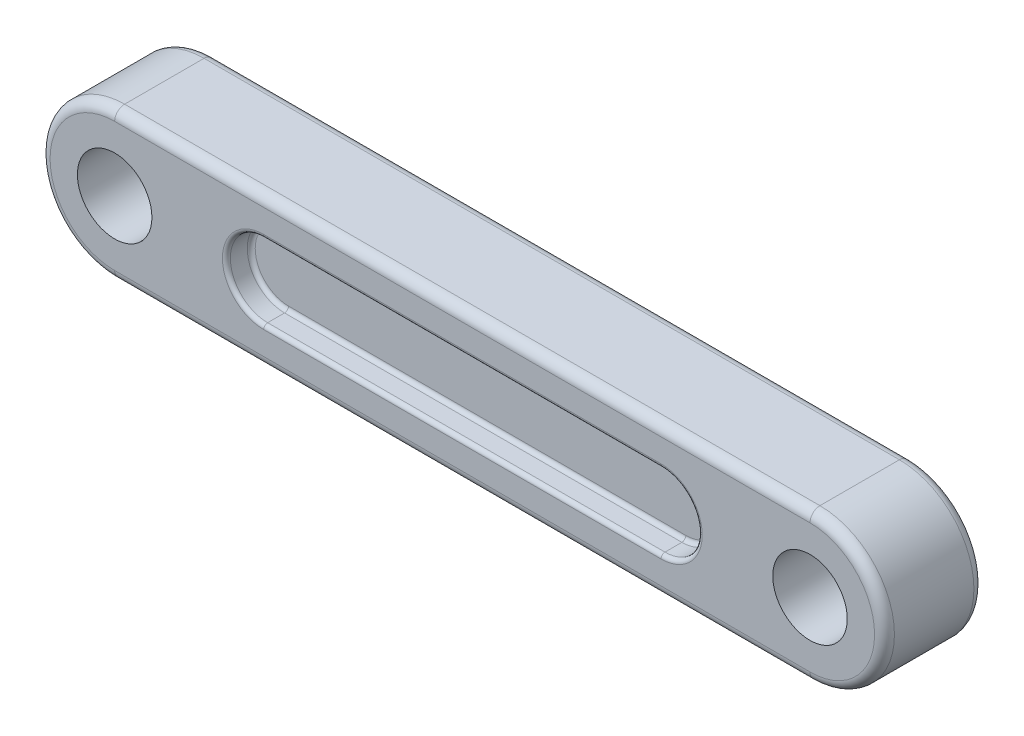
ISO-10303-21;
HEADER;
FILE_DESCRIPTION(('STEP AP214'),'2;1');
FILE_NAME('part.step','',(''),(''),'','','');
FILE_SCHEMA(('AUTOMOTIVE_DESIGN { 1 0 10303 214 1 1 1 1 }'));
ENDSEC;
DATA;
#1=APPLICATION_CONTEXT('core data for automotive mechanical design processes');
#2=APPLICATION_PROTOCOL_DEFINITION('international standard','automotive_design',2000,#1);
#3=PRODUCT_CONTEXT('',#1,'mechanical');
#4=PRODUCT('Part','Part','',(#3));
#5=PRODUCT_RELATED_PRODUCT_CATEGORY('part','',(#4));
#6=PRODUCT_DEFINITION_FORMATION('','',#4);
#7=PRODUCT_DEFINITION_CONTEXT('part definition',#1,'design');
#8=PRODUCT_DEFINITION('design','',#6,#7);
#9=PRODUCT_DEFINITION_SHAPE('','',#8);
#10=(LENGTH_UNIT() NAMED_UNIT(*) SI_UNIT(.MILLI.,.METRE.));
#11=(NAMED_UNIT(*) PLANE_ANGLE_UNIT() SI_UNIT($,.RADIAN.));
#12=(NAMED_UNIT(*) SI_UNIT($,.STERADIAN.) SOLID_ANGLE_UNIT());
#13=UNCERTAINTY_MEASURE_WITH_UNIT(LENGTH_MEASURE(1.E-05),#10,'distance_accuracy_value','');
#14=(GEOMETRIC_REPRESENTATION_CONTEXT(3) GLOBAL_UNCERTAINTY_ASSIGNED_CONTEXT((#13)) GLOBAL_UNIT_ASSIGNED_CONTEXT((#10,
#11,#12)) REPRESENTATION_CONTEXT('',''));
#15=CARTESIAN_POINT('',(0.,0.,0.));
#16=DIRECTION('',(0.,0.,1.));
#17=DIRECTION('',(1.,0.,0.));
#18=AXIS2_PLACEMENT_3D('',#15,#16,#17);
#19=CARTESIAN_POINT('',(-44.45,0.,12.7));
#20=DIRECTION('',(0.,0.,1.));
#21=DIRECTION('',(1.,0.,0.));
#22=AXIS2_PLACEMENT_3D('',#19,#20,#21);
#23=PLANE('',#22);
#24=CARTESIAN_POINT('',(25.4,0.,12.7));
#25=DIRECTION('',(0.,0.,1.));
#26=DIRECTION('',(1.,0.,0.));
#27=AXIS2_PLACEMENT_3D('',#24,#25,#26);
#28=CIRCLE('',#27,5.2705);
#29=CARTESIAN_POINT('',(25.4,5.2705,12.7));
#30=VERTEX_POINT('',#29);
#31=CARTESIAN_POINT('',(25.4,-5.2705,12.7));
#32=VERTEX_POINT('',#31);
#33=EDGE_CURVE('E297',#30,#32,#28,.F.);
#34=ORIENTED_EDGE('',*,*,#33,.T.);
#35=DIRECTION('',(1.,0.,0.));
#36=VECTOR('',#35,1.);
#37=CARTESIAN_POINT('',(-25.4,-5.2705,12.7));
#38=LINE('',#37,#36);
#39=CARTESIAN_POINT('',(-25.4,-5.2705,12.7));
#40=VERTEX_POINT('',#39);
#41=EDGE_CURVE('E299',#32,#40,#38,.F.);
#42=ORIENTED_EDGE('',*,*,#41,.T.);
#43=CARTESIAN_POINT('',(-25.4,0.,12.7));
#44=DIRECTION('',(0.,0.,1.));
#45=DIRECTION('',(1.,0.,0.));
#46=AXIS2_PLACEMENT_3D('',#43,#44,#45);
#47=CIRCLE('',#46,5.2705);
#48=CARTESIAN_POINT('',(-25.4,5.2705,12.7));
#49=VERTEX_POINT('',#48);
#50=EDGE_CURVE('E295',#40,#49,#47,.F.);
#51=ORIENTED_EDGE('',*,*,#50,.T.);
#52=DIRECTION('',(-1.,0.,0.));
#53=VECTOR('',#52,1.);
#54=CARTESIAN_POINT('',(25.4,5.2705,12.7));
#55=LINE('',#54,#53);
#56=EDGE_CURVE('E293',#49,#30,#55,.F.);
#57=ORIENTED_EDGE('',*,*,#56,.T.);
#58=EDGE_LOOP('',(#34,#42,#51,#57));
#59=FACE_BOUND('',#58,.T.);
#60=DIRECTION('',(1.,0.,0.));
#61=VECTOR('',#60,1.);
#62=CARTESIAN_POINT('',(44.45,-8.255,12.7));
#63=LINE('',#62,#61);
#64=CARTESIAN_POINT('',(-44.45,-8.25499999999998,12.7));
#65=VERTEX_POINT('',#64);
#66=CARTESIAN_POINT('',(44.45,-8.255,12.7));
#67=VERTEX_POINT('',#66);
#68=EDGE_CURVE('E232',#65,#67,#63,.T.);
#69=ORIENTED_EDGE('',*,*,#68,.T.);
#70=CARTESIAN_POINT('',(44.45,0.,12.7));
#71=DIRECTION('',(0.,0.,1.));
#72=DIRECTION('',(1.,0.,0.));
#73=AXIS2_PLACEMENT_3D('',#70,#71,#72);
#74=CIRCLE('',#73,8.255);
#75=CARTESIAN_POINT('',(44.45,8.255,12.7));
#76=VERTEX_POINT('',#75);
#77=EDGE_CURVE('E244',#67,#76,#74,.T.);
#78=ORIENTED_EDGE('',*,*,#77,.T.);
#79=DIRECTION('',(-1.,0.,0.));
#80=VECTOR('',#79,1.);
#81=CARTESIAN_POINT('',(-44.45,8.255,12.7));
#82=LINE('',#81,#80);
#83=CARTESIAN_POINT('',(-44.45,8.255,12.7));
#84=VERTEX_POINT('',#83);
#85=EDGE_CURVE('E424',#76,#84,#82,.T.);
#86=ORIENTED_EDGE('',*,*,#85,.T.);
#87=CARTESIAN_POINT('',(-44.45,0.,12.7));
#88=DIRECTION('',(0.,0.,1.));
#89=DIRECTION('',(1.,0.,0.));
#90=AXIS2_PLACEMENT_3D('',#87,#88,#89);
#91=CIRCLE('',#90,8.255);
#92=EDGE_CURVE('E426',#84,#65,#91,.T.);
#93=ORIENTED_EDGE('',*,*,#92,.T.);
#94=EDGE_LOOP('',(#69,#78,#86,#93));
#95=FACE_BOUND('',#94,.T.);
#96=CARTESIAN_POINT('',(-44.45,0.,12.7));
#97=DIRECTION('',(0.,0.,1.));
#98=DIRECTION('',(1.,0.,0.));
#99=AXIS2_PLACEMENT_3D('',#96,#97,#98);
#100=CIRCLE('',#99,4.7625);
#101=CARTESIAN_POINT('',(-39.6875,0.,12.7));
#102=VERTEX_POINT('',#101);
#103=EDGE_CURVE('E395',#102,#102,#100,.T.);
#104=ORIENTED_EDGE('',*,*,#103,.F.);
#105=EDGE_LOOP('',(#104));
#106=FACE_BOUND('',#105,.T.);
#107=CARTESIAN_POINT('',(44.45,0.,12.7));
#108=DIRECTION('',(0.,0.,1.));
#109=DIRECTION('',(1.,0.,0.));
#110=AXIS2_PLACEMENT_3D('',#107,#108,#109);
#111=CIRCLE('',#110,4.7625);
#112=CARTESIAN_POINT('',(49.2125,0.,12.7));
#113=VERTEX_POINT('',#112);
#114=EDGE_CURVE('E387',#113,#113,#111,.T.);
#115=ORIENTED_EDGE('',*,*,#114,.F.);
#116=EDGE_LOOP('',(#115));
#117=FACE_BOUND('',#116,.T.);
#118=ADVANCED_FACE('F33',(#59,#95,#106,#117),#23,.T.);
#119=CARTESIAN_POINT('',(-44.45,0.,0.));
#120=DIRECTION('',(0.,0.,1.));
#121=DIRECTION('',(1.,0.,0.));
#122=AXIS2_PLACEMENT_3D('',#119,#120,#121);
#123=PLANE('',#122);
#124=CARTESIAN_POINT('',(25.4,0.,0.));
#125=DIRECTION('',(0.,0.,1.));
#126=DIRECTION('',(1.,0.,0.));
#127=AXIS2_PLACEMENT_3D('',#124,#125,#126);
#128=CIRCLE('',#127,5.2705);
#129=CARTESIAN_POINT('',(25.4,-5.27050000000001,0.));
#130=VERTEX_POINT('',#129);
#131=CARTESIAN_POINT('',(25.4,5.27049999999999,0.));
#132=VERTEX_POINT('',#131);
#133=EDGE_CURVE('E259',#130,#132,#128,.T.);
#134=ORIENTED_EDGE('',*,*,#133,.T.);
#135=DIRECTION('',(1.,0.,0.));
#136=VECTOR('',#135,1.);
#137=CARTESIAN_POINT('',(-44.45,5.2705,0.));
#138=LINE('',#137,#136);
#139=CARTESIAN_POINT('',(-25.4,5.2705,0.));
#140=VERTEX_POINT('',#139);
#141=EDGE_CURVE('E263',#132,#140,#138,.F.);
#142=ORIENTED_EDGE('',*,*,#141,.T.);
#143=CARTESIAN_POINT('',(-25.4,0.,0.));
#144=DIRECTION('',(0.,0.,1.));
#145=DIRECTION('',(1.,0.,0.));
#146=AXIS2_PLACEMENT_3D('',#143,#144,#145);
#147=CIRCLE('',#146,5.2705);
#148=CARTESIAN_POINT('',(-25.4,-5.2705,0.));
#149=VERTEX_POINT('',#148);
#150=EDGE_CURVE('E261',#140,#149,#147,.T.);
#151=ORIENTED_EDGE('',*,*,#150,.T.);
#152=DIRECTION('',(-1.,0.,0.));
#153=VECTOR('',#152,1.);
#154=CARTESIAN_POINT('',(-44.45,-5.2705,0.));
#155=LINE('',#154,#153);
#156=EDGE_CURVE('E257',#149,#130,#155,.F.);
#157=ORIENTED_EDGE('',*,*,#156,.T.);
#158=EDGE_LOOP('',(#134,#142,#151,#157));
#159=FACE_BOUND('',#158,.T.);
#160=DIRECTION('',(1.,0.,0.));
#161=VECTOR('',#160,1.);
#162=CARTESIAN_POINT('',(-44.45,-8.255,0.));
#163=LINE('',#162,#161);
#164=CARTESIAN_POINT('',(44.45,-8.25499999999998,0.));
#165=VERTEX_POINT('',#164);
#166=CARTESIAN_POINT('',(-44.45,-8.255,0.));
#167=VERTEX_POINT('',#166);
#168=EDGE_CURVE('E411',#165,#167,#163,.F.);
#169=ORIENTED_EDGE('',*,*,#168,.T.);
#170=CARTESIAN_POINT('',(-44.45,0.,0.));
#171=DIRECTION('',(0.,0.,1.));
#172=DIRECTION('',(1.,0.,0.));
#173=AXIS2_PLACEMENT_3D('',#170,#171,#172);
#174=CIRCLE('',#173,8.255);
#175=CARTESIAN_POINT('',(-44.45,8.255,0.));
#176=VERTEX_POINT('',#175);
#177=EDGE_CURVE('E208',#167,#176,#174,.F.);
#178=ORIENTED_EDGE('',*,*,#177,.T.);
#179=DIRECTION('',(-1.,0.,0.));
#180=VECTOR('',#179,1.);
#181=CARTESIAN_POINT('',(-44.45,8.255,0.));
#182=LINE('',#181,#180);
#183=CARTESIAN_POINT('',(44.45,8.25500000000001,0.));
#184=VERTEX_POINT('',#183);
#185=EDGE_CURVE('E409',#176,#184,#182,.F.);
#186=ORIENTED_EDGE('',*,*,#185,.T.);
#187=CARTESIAN_POINT('',(44.45,0.,0.));
#188=DIRECTION('',(0.,0.,1.));
#189=DIRECTION('',(1.,0.,0.));
#190=AXIS2_PLACEMENT_3D('',#187,#188,#189);
#191=CIRCLE('',#190,8.255);
#192=EDGE_CURVE('E407',#184,#165,#191,.F.);
#193=ORIENTED_EDGE('',*,*,#192,.T.);
#194=EDGE_LOOP('',(#169,#178,#186,#193));
#195=FACE_BOUND('',#194,.T.);
#196=CARTESIAN_POINT('',(-44.45,0.,0.));
#197=DIRECTION('',(0.,0.,1.));
#198=DIRECTION('',(1.,0.,0.));
#199=AXIS2_PLACEMENT_3D('',#196,#197,#198);
#200=CIRCLE('',#199,4.7625);
#201=CARTESIAN_POINT('',(-39.6875,0.,0.));
#202=VERTEX_POINT('',#201);
#203=EDGE_CURVE('E390',#202,#202,#200,.T.);
#204=ORIENTED_EDGE('',*,*,#203,.T.);
#205=EDGE_LOOP('',(#204));
#206=FACE_BOUND('',#205,.T.);
#207=CARTESIAN_POINT('',(44.45,0.,0.));
#208=DIRECTION('',(0.,0.,1.));
#209=DIRECTION('',(1.,0.,0.));
#210=AXIS2_PLACEMENT_3D('',#207,#208,#209);
#211=CIRCLE('',#210,4.7625);
#212=CARTESIAN_POINT('',(49.2125,0.,0.));
#213=VERTEX_POINT('',#212);
#214=EDGE_CURVE('E391',#213,#213,#211,.T.);
#215=ORIENTED_EDGE('',*,*,#214,.T.);
#216=EDGE_LOOP('',(#215));
#217=FACE_BOUND('',#216,.T.);
#218=ADVANCED_FACE('F466',(#159,#195,#206,#217),#123,.F.);
#219=CARTESIAN_POINT('',(-44.45,0.,12.7));
#220=DIRECTION('',(0.,0.,-1.));
#221=DIRECTION('',(-1.,0.,0.));
#222=AXIS2_PLACEMENT_3D('',#219,#220,#221);
#223=CYLINDRICAL_SURFACE('',#222,9.525);
#224=DIRECTION('',(0.,0.,-1.));
#225=VECTOR('',#224,1.);
#226=CARTESIAN_POINT('',(-44.45,9.525,12.7));
#227=LINE('',#226,#225);
#228=CARTESIAN_POINT('',(-44.45,9.525,11.43));
#229=VERTEX_POINT('',#228);
#230=CARTESIAN_POINT('',(-44.45,9.525,1.27));
#231=VERTEX_POINT('',#230);
#232=EDGE_CURVE('E398',#229,#231,#227,.T.);
#233=ORIENTED_EDGE('',*,*,#232,.T.);
#234=CARTESIAN_POINT('',(-44.45,0.,1.27));
#235=DIRECTION('',(0.,0.,1.));
#236=DIRECTION('',(1.,0.,0.));
#237=AXIS2_PLACEMENT_3D('',#234,#235,#236);
#238=CIRCLE('',#237,9.525);
#239=CARTESIAN_POINT('',(-44.45,-9.525,1.27));
#240=VERTEX_POINT('',#239);
#241=EDGE_CURVE('E218',#231,#240,#238,.T.);
#242=ORIENTED_EDGE('',*,*,#241,.T.);
#243=DIRECTION('',(0.,0.,-1.));
#244=VECTOR('',#243,1.);
#245=CARTESIAN_POINT('',(-44.45,-9.525,12.7));
#246=LINE('',#245,#244);
#247=CARTESIAN_POINT('',(-44.45,-9.525,11.43));
#248=VERTEX_POINT('',#247);
#249=EDGE_CURVE('E200',#248,#240,#246,.T.);
#250=ORIENTED_EDGE('',*,*,#249,.F.);
#251=CARTESIAN_POINT('',(-44.45,0.,11.43));
#252=DIRECTION('',(0.,0.,1.));
#253=DIRECTION('',(1.,0.,0.));
#254=AXIS2_PLACEMENT_3D('',#251,#252,#253);
#255=CIRCLE('',#254,9.525);
#256=EDGE_CURVE('E215',#248,#229,#255,.F.);
#257=ORIENTED_EDGE('',*,*,#256,.T.);
#258=EDGE_LOOP('',(#233,#242,#250,#257));
#259=FACE_BOUND('',#258,.T.);
#260=ADVANCED_FACE('F214',(#259),#223,.T.);
#261=CARTESIAN_POINT('',(-44.45,-9.525,12.7));
#262=DIRECTION('',(0.,1.,0.));
#263=DIRECTION('',(0.,0.,1.));
#264=AXIS2_PLACEMENT_3D('',#261,#262,#263);
#265=PLANE('',#264);
#266=ORIENTED_EDGE('',*,*,#249,.T.);
#267=DIRECTION('',(1.,0.,0.));
#268=VECTOR('',#267,1.);
#269=CARTESIAN_POINT('',(-44.45,-9.525,1.27));
#270=LINE('',#269,#268);
#271=CARTESIAN_POINT('',(44.45,-9.52499999999998,1.27));
#272=VERTEX_POINT('',#271);
#273=EDGE_CURVE('E207',#240,#272,#270,.T.);
#274=ORIENTED_EDGE('',*,*,#273,.T.);
#275=DIRECTION('',(0.,0.,-1.));
#276=VECTOR('',#275,1.);
#277=CARTESIAN_POINT('',(44.45,-9.52499999999998,12.7));
#278=LINE('',#277,#276);
#279=CARTESIAN_POINT('',(44.45,-9.52499999999998,11.43));
#280=VERTEX_POINT('',#279);
#281=EDGE_CURVE('E202',#280,#272,#278,.T.);
#282=ORIENTED_EDGE('',*,*,#281,.F.);
#283=DIRECTION('',(1.,0.,0.));
#284=VECTOR('',#283,1.);
#285=CARTESIAN_POINT('',(-44.45,-9.525,11.43));
#286=LINE('',#285,#284);
#287=EDGE_CURVE('E197',#280,#248,#286,.F.);
#288=ORIENTED_EDGE('',*,*,#287,.T.);
#289=EDGE_LOOP('',(#266,#274,#282,#288));
#290=FACE_BOUND('',#289,.T.);
#291=ADVANCED_FACE('F199',(#290),#265,.F.);
#292=CARTESIAN_POINT('',(44.45,0.,12.7));
#293=DIRECTION('',(0.,0.,-1.));
#294=DIRECTION('',(-1.,0.,0.));
#295=AXIS2_PLACEMENT_3D('',#292,#293,#294);
#296=CYLINDRICAL_SURFACE('',#295,9.525);
#297=ORIENTED_EDGE('',*,*,#281,.T.);
#298=CARTESIAN_POINT('',(44.45,0.,1.27));
#299=DIRECTION('',(0.,0.,1.));
#300=DIRECTION('',(1.,0.,0.));
#301=AXIS2_PLACEMENT_3D('',#298,#299,#300);
#302=CIRCLE('',#301,9.525);
#303=CARTESIAN_POINT('',(44.45,9.525,1.27));
#304=VERTEX_POINT('',#303);
#305=EDGE_CURVE('E422',#272,#304,#302,.T.);
#306=ORIENTED_EDGE('',*,*,#305,.T.);
#307=DIRECTION('',(0.,0.,-1.));
#308=VECTOR('',#307,1.);
#309=CARTESIAN_POINT('',(44.45,9.525,12.7));
#310=LINE('',#309,#308);
#311=CARTESIAN_POINT('',(44.45,9.525,11.43));
#312=VERTEX_POINT('',#311);
#313=EDGE_CURVE('E402',#312,#304,#310,.T.);
#314=ORIENTED_EDGE('',*,*,#313,.F.);
#315=CARTESIAN_POINT('',(44.45,0.,11.43));
#316=DIRECTION('',(0.,0.,1.));
#317=DIRECTION('',(1.,0.,0.));
#318=AXIS2_PLACEMENT_3D('',#315,#316,#317);
#319=CIRCLE('',#318,9.525);
#320=EDGE_CURVE('E420',#312,#280,#319,.F.);
#321=ORIENTED_EDGE('',*,*,#320,.T.);
#322=EDGE_LOOP('',(#297,#306,#314,#321));
#323=FACE_BOUND('',#322,.T.);
#324=ADVANCED_FACE('F452',(#323),#296,.T.);
#325=CARTESIAN_POINT('',(-44.45,9.525,12.7));
#326=DIRECTION('',(0.,-1.,0.));
#327=DIRECTION('',(0.,0.,-1.));
#328=AXIS2_PLACEMENT_3D('',#325,#326,#327);
#329=PLANE('',#328);
#330=ORIENTED_EDGE('',*,*,#313,.T.);
#331=DIRECTION('',(-1.,0.,0.));
#332=VECTOR('',#331,1.);
#333=CARTESIAN_POINT('',(-44.45,9.525,1.27));
#334=LINE('',#333,#332);
#335=EDGE_CURVE('E418',#304,#231,#334,.T.);
#336=ORIENTED_EDGE('',*,*,#335,.T.);
#337=ORIENTED_EDGE('',*,*,#232,.F.);
#338=DIRECTION('',(-1.,0.,0.));
#339=VECTOR('',#338,1.);
#340=CARTESIAN_POINT('',(44.45,9.525,11.43));
#341=LINE('',#340,#339);
#342=EDGE_CURVE('E416',#229,#312,#341,.F.);
#343=ORIENTED_EDGE('',*,*,#342,.T.);
#344=EDGE_LOOP('',(#330,#336,#337,#343));
#345=FACE_BOUND('',#344,.T.);
#346=ADVANCED_FACE('F449',(#345),#329,.F.);
#347=CARTESIAN_POINT('',(-44.45,0.,12.7));
#348=DIRECTION('',(0.,0.,-1.));
#349=DIRECTION('',(-1.,0.,0.));
#350=AXIS2_PLACEMENT_3D('',#347,#348,#349);
#351=CYLINDRICAL_SURFACE('',#350,4.7625);
#352=ORIENTED_EDGE('',*,*,#103,.T.);
#353=EDGE_LOOP('',(#352));
#354=FACE_BOUND('',#353,.T.);
#355=ORIENTED_EDGE('',*,*,#203,.F.);
#356=EDGE_LOOP('',(#355));
#357=FACE_BOUND('',#356,.T.);
#358=ADVANCED_FACE('F491',(#354,#357),#351,.F.);
#359=CARTESIAN_POINT('',(44.45,0.,12.7));
#360=DIRECTION('',(0.,0.,-1.));
#361=DIRECTION('',(-1.,0.,0.));
#362=AXIS2_PLACEMENT_3D('',#359,#360,#361);
#363=CYLINDRICAL_SURFACE('',#362,4.7625);
#364=ORIENTED_EDGE('',*,*,#114,.T.);
#365=EDGE_LOOP('',(#364));
#366=FACE_BOUND('',#365,.T.);
#367=ORIENTED_EDGE('',*,*,#214,.F.);
#368=EDGE_LOOP('',(#367));
#369=FACE_BOUND('',#368,.T.);
#370=ADVANCED_FACE('F481',(#366,#369),#363,.F.);
#371=CARTESIAN_POINT('',(44.45,0.,1.27));
#372=DIRECTION('',(0.,0.,1.));
#373=DIRECTION('',(1.,0.,0.));
#374=AXIS2_PLACEMENT_3D('',#371,#372,#373);
#375=TOROIDAL_SURFACE('',#374,8.255,1.27);
#376=CARTESIAN_POINT('',(44.45,-8.25499999999998,1.27));
#377=DIRECTION('',(-1.,0.,0.));
#378=DIRECTION('',(0.,0.,1.));
#379=AXIS2_PLACEMENT_3D('',#376,#377,#378);
#380=CIRCLE('',#379,1.27);
#381=EDGE_CURVE('E432',#165,#272,#380,.T.);
#382=ORIENTED_EDGE('',*,*,#381,.F.);
#383=ORIENTED_EDGE('',*,*,#192,.F.);
#384=CARTESIAN_POINT('',(44.45,8.25500000000001,1.27));
#385=DIRECTION('',(-1.,0.,0.));
#386=DIRECTION('',(0.,0.,1.));
#387=AXIS2_PLACEMENT_3D('',#384,#385,#386);
#388=CIRCLE('',#387,1.27);
#389=EDGE_CURVE('E394',#304,#184,#388,.T.);
#390=ORIENTED_EDGE('',*,*,#389,.F.);
#391=ORIENTED_EDGE('',*,*,#305,.F.);
#392=EDGE_LOOP('',(#382,#383,#390,#391));
#393=FACE_BOUND('',#392,.T.);
#394=ADVANCED_FACE('F456',(#393),#375,.T.);
#395=CARTESIAN_POINT('',(-44.45,8.255,1.27));
#396=DIRECTION('',(-1.,0.,0.));
#397=DIRECTION('',(0.,0.,1.));
#398=AXIS2_PLACEMENT_3D('',#395,#396,#397);
#399=CYLINDRICAL_SURFACE('',#398,1.27);
#400=ORIENTED_EDGE('',*,*,#389,.T.);
#401=ORIENTED_EDGE('',*,*,#185,.F.);
#402=CARTESIAN_POINT('',(-44.45,8.255,1.27));
#403=DIRECTION('',(-1.,0.,0.));
#404=DIRECTION('',(0.,0.,1.));
#405=AXIS2_PLACEMENT_3D('',#402,#403,#404);
#406=CIRCLE('',#405,1.27);
#407=EDGE_CURVE('E235',#231,#176,#406,.T.);
#408=ORIENTED_EDGE('',*,*,#407,.F.);
#409=ORIENTED_EDGE('',*,*,#335,.F.);
#410=EDGE_LOOP('',(#400,#401,#408,#409));
#411=FACE_BOUND('',#410,.T.);
#412=ADVANCED_FACE('F473',(#411),#399,.T.);
#413=CARTESIAN_POINT('',(-44.45,-8.255,1.27));
#414=DIRECTION('',(1.,0.,0.));
#415=DIRECTION('',(0.,0.,-1.));
#416=AXIS2_PLACEMENT_3D('',#413,#414,#415);
#417=CYLINDRICAL_SURFACE('',#416,1.27);
#418=ORIENTED_EDGE('',*,*,#381,.T.);
#419=ORIENTED_EDGE('',*,*,#273,.F.);
#420=CARTESIAN_POINT('',(-44.45,-8.255,1.27));
#421=DIRECTION('',(-1.,0.,0.));
#422=DIRECTION('',(0.,0.,1.));
#423=AXIS2_PLACEMENT_3D('',#420,#421,#422);
#424=CIRCLE('',#423,1.27);
#425=EDGE_CURVE('E233',#167,#240,#424,.T.);
#426=ORIENTED_EDGE('',*,*,#425,.F.);
#427=ORIENTED_EDGE('',*,*,#168,.F.);
#428=EDGE_LOOP('',(#418,#419,#426,#427));
#429=FACE_BOUND('',#428,.T.);
#430=ADVANCED_FACE('F462',(#429),#417,.T.);
#431=CARTESIAN_POINT('',(-44.45,0.,1.27));
#432=DIRECTION('',(0.,0.,1.));
#433=DIRECTION('',(1.,0.,0.));
#434=AXIS2_PLACEMENT_3D('',#431,#432,#433);
#435=TOROIDAL_SURFACE('',#434,8.255,1.27);
#436=ORIENTED_EDGE('',*,*,#407,.T.);
#437=ORIENTED_EDGE('',*,*,#177,.F.);
#438=ORIENTED_EDGE('',*,*,#425,.T.);
#439=ORIENTED_EDGE('',*,*,#241,.F.);
#440=EDGE_LOOP('',(#436,#437,#438,#439));
#441=FACE_BOUND('',#440,.T.);
#442=ADVANCED_FACE('F469',(#441),#435,.T.);
#443=CARTESIAN_POINT('',(-44.45,0.,11.43));
#444=DIRECTION('',(0.,0.,1.));
#445=DIRECTION('',(1.,0.,0.));
#446=AXIS2_PLACEMENT_3D('',#443,#444,#445);
#447=TOROIDAL_SURFACE('',#446,8.255,1.27);
#448=CARTESIAN_POINT('',(-44.45,8.25500000000001,11.43));
#449=DIRECTION('',(1.,0.,0.));
#450=DIRECTION('',(0.,0.,-1.));
#451=AXIS2_PLACEMENT_3D('',#448,#449,#450);
#452=CIRCLE('',#451,1.27);
#453=EDGE_CURVE('E228',#229,#84,#452,.T.);
#454=ORIENTED_EDGE('',*,*,#453,.F.);
#455=ORIENTED_EDGE('',*,*,#256,.F.);
#456=CARTESIAN_POINT('',(-44.45,-8.25499999999998,11.43));
#457=DIRECTION('',(1.,0.,0.));
#458=DIRECTION('',(0.,0.,-1.));
#459=AXIS2_PLACEMENT_3D('',#456,#457,#458);
#460=CIRCLE('',#459,1.27);
#461=EDGE_CURVE('E225',#65,#248,#460,.T.);
#462=ORIENTED_EDGE('',*,*,#461,.F.);
#463=ORIENTED_EDGE('',*,*,#92,.F.);
#464=EDGE_LOOP('',(#454,#455,#462,#463));
#465=FACE_BOUND('',#464,.T.);
#466=ADVANCED_FACE('F223',(#465),#447,.T.);
#467=CARTESIAN_POINT('',(-44.45,-8.255,11.43));
#468=DIRECTION('',(-1.,0.,0.));
#469=DIRECTION('',(0.,0.,1.));
#470=AXIS2_PLACEMENT_3D('',#467,#468,#469);
#471=CYLINDRICAL_SURFACE('',#470,1.27);
#472=ORIENTED_EDGE('',*,*,#461,.T.);
#473=ORIENTED_EDGE('',*,*,#287,.F.);
#474=CARTESIAN_POINT('',(44.45,-8.255,11.43));
#475=DIRECTION('',(1.,0.,0.));
#476=DIRECTION('',(0.,0.,-1.));
#477=AXIS2_PLACEMENT_3D('',#474,#475,#476);
#478=CIRCLE('',#477,1.27);
#479=EDGE_CURVE('E237',#67,#280,#478,.T.);
#480=ORIENTED_EDGE('',*,*,#479,.F.);
#481=ORIENTED_EDGE('',*,*,#68,.F.);
#482=EDGE_LOOP('',(#472,#473,#480,#481));
#483=FACE_BOUND('',#482,.T.);
#484=ADVANCED_FACE('F231',(#483),#471,.T.);
#485=CARTESIAN_POINT('',(-44.45,8.255,11.43));
#486=DIRECTION('',(1.,0.,0.));
#487=DIRECTION('',(0.,0.,-1.));
#488=AXIS2_PLACEMENT_3D('',#485,#486,#487);
#489=CYLINDRICAL_SURFACE('',#488,1.27);
#490=ORIENTED_EDGE('',*,*,#453,.T.);
#491=ORIENTED_EDGE('',*,*,#85,.F.);
#492=CARTESIAN_POINT('',(44.45,8.255,11.43));
#493=DIRECTION('',(1.,0.,0.));
#494=DIRECTION('',(0.,0.,-1.));
#495=AXIS2_PLACEMENT_3D('',#492,#493,#494);
#496=CIRCLE('',#495,1.27);
#497=EDGE_CURVE('E437',#312,#76,#496,.T.);
#498=ORIENTED_EDGE('',*,*,#497,.F.);
#499=ORIENTED_EDGE('',*,*,#342,.F.);
#500=EDGE_LOOP('',(#490,#491,#498,#499));
#501=FACE_BOUND('',#500,.T.);
#502=ADVANCED_FACE('F446',(#501),#489,.T.);
#503=CARTESIAN_POINT('',(44.45,0.,11.43));
#504=DIRECTION('',(0.,0.,1.));
#505=DIRECTION('',(1.,0.,0.));
#506=AXIS2_PLACEMENT_3D('',#503,#504,#505);
#507=TOROIDAL_SURFACE('',#506,8.255,1.27);
#508=ORIENTED_EDGE('',*,*,#479,.T.);
#509=ORIENTED_EDGE('',*,*,#320,.F.);
#510=ORIENTED_EDGE('',*,*,#497,.T.);
#511=ORIENTED_EDGE('',*,*,#77,.F.);
#512=EDGE_LOOP('',(#508,#509,#510,#511));
#513=FACE_BOUND('',#512,.T.);
#514=ADVANCED_FACE('F441',(#513),#507,.T.);
#515=CARTESIAN_POINT('',(-25.4,0.,9.525));
#516=DIRECTION('',(0.,0.,1.));
#517=DIRECTION('',(1.,0.,0.));
#518=AXIS2_PLACEMENT_3D('',#515,#516,#517);
#519=CYLINDRICAL_SURFACE('',#518,4.7625);
#520=DIRECTION('',(0.,0.,1.));
#521=VECTOR('',#520,1.);
#522=CARTESIAN_POINT('',(-25.4,-4.7625,9.525));
#523=LINE('',#522,#521);
#524=CARTESIAN_POINT('',(-25.4,-4.7625,10.033));
#525=VERTEX_POINT('',#524);
#526=CARTESIAN_POINT('',(-25.4,-4.7625,12.192));
#527=VERTEX_POINT('',#526);
#528=EDGE_CURVE('E376',#525,#527,#523,.T.);
#529=ORIENTED_EDGE('',*,*,#528,.F.);
#530=CARTESIAN_POINT('',(-25.4,0.,10.033));
#531=DIRECTION('',(0.,0.,1.));
#532=DIRECTION('',(1.,0.,0.));
#533=AXIS2_PLACEMENT_3D('',#530,#531,#532);
#534=CIRCLE('',#533,4.7625);
#535=CARTESIAN_POINT('',(-25.4,4.7625,10.033));
#536=VERTEX_POINT('',#535);
#537=EDGE_CURVE('E56',#525,#536,#534,.F.);
#538=ORIENTED_EDGE('',*,*,#537,.T.);
#539=DIRECTION('',(0.,0.,1.));
#540=VECTOR('',#539,1.);
#541=CARTESIAN_POINT('',(-25.4,4.7625,9.525));
#542=LINE('',#541,#540);
#543=CARTESIAN_POINT('',(-25.4,4.7625,12.192));
#544=VERTEX_POINT('',#543);
#545=EDGE_CURVE('E381',#536,#544,#542,.T.);
#546=ORIENTED_EDGE('',*,*,#545,.T.);
#547=CARTESIAN_POINT('',(-25.4,0.,12.192));
#548=DIRECTION('',(0.,0.,1.));
#549=DIRECTION('',(1.,0.,0.));
#550=AXIS2_PLACEMENT_3D('',#547,#548,#549);
#551=CIRCLE('',#550,4.7625);
#552=EDGE_CURVE('E306',#544,#527,#551,.T.);
#553=ORIENTED_EDGE('',*,*,#552,.T.);
#554=EDGE_LOOP('',(#529,#538,#546,#553));
#555=FACE_BOUND('',#554,.T.);
#556=ADVANCED_FACE('F685',(#555),#519,.F.);
#557=CARTESIAN_POINT('',(-25.4,4.7625,9.525));
#558=DIRECTION('',(0.,1.,0.));
#559=DIRECTION('',(-1.,0.,0.));
#560=AXIS2_PLACEMENT_3D('',#557,#558,#559);
#561=PLANE('',#560);
#562=ORIENTED_EDGE('',*,*,#545,.F.);
#563=DIRECTION('',(-1.,0.,0.));
#564=VECTOR('',#563,1.);
#565=CARTESIAN_POINT('',(-25.4,4.7625,10.033));
#566=LINE('',#565,#564);
#567=CARTESIAN_POINT('',(25.4,4.7625,10.033));
#568=VERTEX_POINT('',#567);
#569=EDGE_CURVE('E11',#536,#568,#566,.F.);
#570=ORIENTED_EDGE('',*,*,#569,.T.);
#571=DIRECTION('',(0.,0.,1.));
#572=VECTOR('',#571,1.);
#573=CARTESIAN_POINT('',(25.4,4.7625,9.525));
#574=LINE('',#573,#572);
#575=CARTESIAN_POINT('',(25.4,4.7625,12.192));
#576=VERTEX_POINT('',#575);
#577=EDGE_CURVE('E379',#568,#576,#574,.T.);
#578=ORIENTED_EDGE('',*,*,#577,.T.);
#579=DIRECTION('',(-1.,0.,0.));
#580=VECTOR('',#579,1.);
#581=CARTESIAN_POINT('',(-25.4,4.7625,12.192));
#582=LINE('',#581,#580);
#583=EDGE_CURVE('E42',#576,#544,#582,.T.);
#584=ORIENTED_EDGE('',*,*,#583,.T.);
#585=EDGE_LOOP('',(#562,#570,#578,#584));
#586=FACE_BOUND('',#585,.T.);
#587=ADVANCED_FACE('F678',(#586),#561,.F.);
#588=CARTESIAN_POINT('',(25.4,0.,9.525));
#589=DIRECTION('',(0.,0.,1.));
#590=DIRECTION('',(1.,0.,0.));
#591=AXIS2_PLACEMENT_3D('',#588,#589,#590);
#592=CYLINDRICAL_SURFACE('',#591,4.7625);
#593=ORIENTED_EDGE('',*,*,#577,.F.);
#594=CARTESIAN_POINT('',(25.4,0.,10.033));
#595=DIRECTION('',(0.,0.,1.));
#596=DIRECTION('',(1.,0.,0.));
#597=AXIS2_PLACEMENT_3D('',#594,#595,#596);
#598=CIRCLE('',#597,4.7625);
#599=CARTESIAN_POINT('',(25.4,-4.7625,10.033));
#600=VERTEX_POINT('',#599);
#601=EDGE_CURVE('E304',#568,#600,#598,.F.);
#602=ORIENTED_EDGE('',*,*,#601,.T.);
#603=DIRECTION('',(0.,0.,1.));
#604=VECTOR('',#603,1.);
#605=CARTESIAN_POINT('',(25.4,-4.7625,9.525));
#606=LINE('',#605,#604);
#607=CARTESIAN_POINT('',(25.4,-4.7625,12.192));
#608=VERTEX_POINT('',#607);
#609=EDGE_CURVE('E374',#600,#608,#606,.T.);
#610=ORIENTED_EDGE('',*,*,#609,.T.);
#611=CARTESIAN_POINT('',(25.4,0.,12.192));
#612=DIRECTION('',(0.,0.,1.));
#613=DIRECTION('',(1.,0.,0.));
#614=AXIS2_PLACEMENT_3D('',#611,#612,#613);
#615=CIRCLE('',#614,4.7625);
#616=EDGE_CURVE('E302',#608,#576,#615,.T.);
#617=ORIENTED_EDGE('',*,*,#616,.T.);
#618=EDGE_LOOP('',(#593,#602,#610,#617));
#619=FACE_BOUND('',#618,.T.);
#620=ADVANCED_FACE('F377',(#619),#592,.F.);
#621=CARTESIAN_POINT('',(-25.4,-4.7625,9.525));
#622=DIRECTION('',(0.,-1.,0.));
#623=DIRECTION('',(1.,0.,0.));
#624=AXIS2_PLACEMENT_3D('',#621,#622,#623);
#625=PLANE('',#624);
#626=ORIENTED_EDGE('',*,*,#609,.F.);
#627=DIRECTION('',(1.,0.,0.));
#628=VECTOR('',#627,1.);
#629=CARTESIAN_POINT('',(-25.4,-4.7625,10.033));
#630=LINE('',#629,#628);
#631=EDGE_CURVE('E290',#600,#525,#630,.F.);
#632=ORIENTED_EDGE('',*,*,#631,.T.);
#633=ORIENTED_EDGE('',*,*,#528,.T.);
#634=DIRECTION('',(1.,0.,0.));
#635=VECTOR('',#634,1.);
#636=CARTESIAN_POINT('',(25.4,-4.7625,12.192));
#637=LINE('',#636,#635);
#638=EDGE_CURVE('E287',#527,#608,#637,.T.);
#639=ORIENTED_EDGE('',*,*,#638,.T.);
#640=EDGE_LOOP('',(#626,#632,#633,#639));
#641=FACE_BOUND('',#640,.T.);
#642=ADVANCED_FACE('F373',(#641),#625,.F.);
#643=CARTESIAN_POINT('',(-25.4,0.,9.525));
#644=DIRECTION('',(0.,0.,1.));
#645=DIRECTION('',(1.,0.,0.));
#646=AXIS2_PLACEMENT_3D('',#643,#644,#645);
#647=PLANE('',#646);
#648=CARTESIAN_POINT('',(-25.4,0.,9.525));
#649=DIRECTION('',(0.,0.,1.));
#650=DIRECTION('',(1.,0.,0.));
#651=AXIS2_PLACEMENT_3D('',#648,#649,#650);
#652=CIRCLE('',#651,4.2545);
#653=CARTESIAN_POINT('',(-25.4,4.2545,9.525));
#654=VERTEX_POINT('',#653);
#655=CARTESIAN_POINT('',(-25.4,-4.2545,9.525));
#656=VERTEX_POINT('',#655);
#657=EDGE_CURVE('E280',#654,#656,#652,.T.);
#658=ORIENTED_EDGE('',*,*,#657,.T.);
#659=DIRECTION('',(1.,0.,0.));
#660=VECTOR('',#659,1.);
#661=CARTESIAN_POINT('',(-25.4,-4.2545,9.525));
#662=LINE('',#661,#660);
#663=CARTESIAN_POINT('',(25.4,-4.2545,9.525));
#664=VERTEX_POINT('',#663);
#665=EDGE_CURVE('E284',#656,#664,#662,.T.);
#666=ORIENTED_EDGE('',*,*,#665,.T.);
#667=CARTESIAN_POINT('',(25.4,0.,9.525));
#668=DIRECTION('',(0.,0.,1.));
#669=DIRECTION('',(1.,0.,0.));
#670=AXIS2_PLACEMENT_3D('',#667,#668,#669);
#671=CIRCLE('',#670,4.2545);
#672=CARTESIAN_POINT('',(25.4,4.2545,9.525));
#673=VERTEX_POINT('',#672);
#674=EDGE_CURVE('E282',#664,#673,#671,.T.);
#675=ORIENTED_EDGE('',*,*,#674,.T.);
#676=DIRECTION('',(-1.,0.,0.));
#677=VECTOR('',#676,1.);
#678=CARTESIAN_POINT('',(-25.4,4.2545,9.525));
#679=LINE('',#678,#677);
#680=EDGE_CURVE('E278',#673,#654,#679,.T.);
#681=ORIENTED_EDGE('',*,*,#680,.T.);
#682=EDGE_LOOP('',(#658,#666,#675,#681));
#683=FACE_BOUND('',#682,.T.);
#684=ADVANCED_FACE('F657',(#683),#647,.T.);
#685=CARTESIAN_POINT('',(-25.4,0.,3.175));
#686=DIRECTION('',(0.,0.,-1.));
#687=DIRECTION('',(-1.,0.,0.));
#688=AXIS2_PLACEMENT_3D('',#685,#686,#687);
#689=CYLINDRICAL_SURFACE('',#688,4.7625);
#690=DIRECTION('',(0.,0.,-1.));
#691=VECTOR('',#690,1.);
#692=CARTESIAN_POINT('',(-25.4,4.7625,3.175));
#693=LINE('',#692,#691);
#694=CARTESIAN_POINT('',(-25.4,4.7625,2.667));
#695=VERTEX_POINT('',#694);
#696=CARTESIAN_POINT('',(-25.4,4.7625,0.508));
#697=VERTEX_POINT('',#696);
#698=EDGE_CURVE('E321',#695,#697,#693,.T.);
#699=ORIENTED_EDGE('',*,*,#698,.F.);
#700=CARTESIAN_POINT('',(-25.4,0.,2.667));
#701=DIRECTION('',(0.,0.,-1.));
#702=DIRECTION('',(-1.,0.,0.));
#703=AXIS2_PLACEMENT_3D('',#700,#701,#702);
#704=CIRCLE('',#703,4.7625);
#705=CARTESIAN_POINT('',(-25.4,-4.7625,2.667));
#706=VERTEX_POINT('',#705);
#707=EDGE_CURVE('E268',#695,#706,#704,.F.);
#708=ORIENTED_EDGE('',*,*,#707,.T.);
#709=DIRECTION('',(0.,0.,-1.));
#710=VECTOR('',#709,1.);
#711=CARTESIAN_POINT('',(-25.4,-4.7625,3.175));
#712=LINE('',#711,#710);
#713=CARTESIAN_POINT('',(-25.4,-4.7625,0.508));
#714=VERTEX_POINT('',#713);
#715=EDGE_CURVE('E383',#706,#714,#712,.T.);
#716=ORIENTED_EDGE('',*,*,#715,.T.);
#717=CARTESIAN_POINT('',(-25.4,0.,0.508));
#718=DIRECTION('',(0.,0.,1.));
#719=DIRECTION('',(1.,0.,0.));
#720=AXIS2_PLACEMENT_3D('',#717,#718,#719);
#721=CIRCLE('',#720,4.7625);
#722=EDGE_CURVE('E266',#714,#697,#721,.F.);
#723=ORIENTED_EDGE('',*,*,#722,.T.);
#724=EDGE_LOOP('',(#699,#708,#716,#723));
#725=FACE_BOUND('',#724,.T.);
#726=ADVANCED_FACE('F649',(#725),#689,.F.);
#727=CARTESIAN_POINT('',(-25.4,-4.7625,3.175));
#728=DIRECTION('',(0.,-1.,0.));
#729=DIRECTION('',(1.,0.,0.));
#730=AXIS2_PLACEMENT_3D('',#727,#728,#729);
#731=PLANE('',#730);
#732=ORIENTED_EDGE('',*,*,#715,.F.);
#733=DIRECTION('',(-1.,0.,0.));
#734=VECTOR('',#733,1.);
#735=CARTESIAN_POINT('',(-25.4,-4.7625,2.667));
#736=LINE('',#735,#734);
#737=CARTESIAN_POINT('',(25.4,-4.76250000000001,2.667));
#738=VERTEX_POINT('',#737);
#739=EDGE_CURVE('E276',#706,#738,#736,.F.);
#740=ORIENTED_EDGE('',*,*,#739,.T.);
#741=DIRECTION('',(0.,0.,-1.));
#742=VECTOR('',#741,1.);
#743=CARTESIAN_POINT('',(25.4,-4.76250000000001,3.175));
#744=LINE('',#743,#742);
#745=CARTESIAN_POINT('',(25.4,-4.76250000000001,0.508));
#746=VERTEX_POINT('',#745);
#747=EDGE_CURVE('E866',#738,#746,#744,.T.);
#748=ORIENTED_EDGE('',*,*,#747,.T.);
#749=DIRECTION('',(-1.,0.,0.));
#750=VECTOR('',#749,1.);
#751=CARTESIAN_POINT('',(-25.4,-4.7625,0.508));
#752=LINE('',#751,#750);
#753=EDGE_CURVE('E274',#746,#714,#752,.T.);
#754=ORIENTED_EDGE('',*,*,#753,.T.);
#755=EDGE_LOOP('',(#732,#740,#748,#754));
#756=FACE_BOUND('',#755,.T.);
#757=ADVANCED_FACE('F641',(#756),#731,.F.);
#758=CARTESIAN_POINT('',(25.4,0.,3.175));
#759=DIRECTION('',(0.,0.,-1.));
#760=DIRECTION('',(-1.,0.,0.));
#761=AXIS2_PLACEMENT_3D('',#758,#759,#760);
#762=CYLINDRICAL_SURFACE('',#761,4.7625);
#763=ORIENTED_EDGE('',*,*,#747,.F.);
#764=CARTESIAN_POINT('',(25.4,0.,2.667));
#765=DIRECTION('',(0.,0.,-1.));
#766=DIRECTION('',(-1.,0.,0.));
#767=AXIS2_PLACEMENT_3D('',#764,#765,#766);
#768=CIRCLE('',#767,4.7625);
#769=CARTESIAN_POINT('',(25.4,4.76249999999999,2.667));
#770=VERTEX_POINT('',#769);
#771=EDGE_CURVE('E272',#738,#770,#768,.F.);
#772=ORIENTED_EDGE('',*,*,#771,.T.);
#773=DIRECTION('',(0.,0.,-1.));
#774=VECTOR('',#773,1.);
#775=CARTESIAN_POINT('',(25.4,4.76249999999999,3.175));
#776=LINE('',#775,#774);
#777=CARTESIAN_POINT('',(25.4,4.76249999999999,0.508));
#778=VERTEX_POINT('',#777);
#779=EDGE_CURVE('E863',#770,#778,#776,.T.);
#780=ORIENTED_EDGE('',*,*,#779,.T.);
#781=CARTESIAN_POINT('',(25.4,0.,0.508));
#782=DIRECTION('',(0.,0.,1.));
#783=DIRECTION('',(1.,0.,0.));
#784=AXIS2_PLACEMENT_3D('',#781,#782,#783);
#785=CIRCLE('',#784,4.7625);
#786=EDGE_CURVE('E270',#778,#746,#785,.F.);
#787=ORIENTED_EDGE('',*,*,#786,.T.);
#788=EDGE_LOOP('',(#763,#772,#780,#787));
#789=FACE_BOUND('',#788,.T.);
#790=ADVANCED_FACE('F633',(#789),#762,.F.);
#791=CARTESIAN_POINT('',(-25.4,4.7625,3.175));
#792=DIRECTION('',(0.,1.,0.));
#793=DIRECTION('',(-1.,0.,0.));
#794=AXIS2_PLACEMENT_3D('',#791,#792,#793);
#795=PLANE('',#794);
#796=ORIENTED_EDGE('',*,*,#779,.F.);
#797=DIRECTION('',(1.,0.,0.));
#798=VECTOR('',#797,1.);
#799=CARTESIAN_POINT('',(-25.4,4.7625,2.667));
#800=LINE('',#799,#798);
#801=EDGE_CURVE('E254',#770,#695,#800,.F.);
#802=ORIENTED_EDGE('',*,*,#801,.T.);
#803=ORIENTED_EDGE('',*,*,#698,.T.);
#804=DIRECTION('',(1.,0.,0.));
#805=VECTOR('',#804,1.);
#806=CARTESIAN_POINT('',(-25.4,4.7625,0.508));
#807=LINE('',#806,#805);
#808=EDGE_CURVE('E251',#697,#778,#807,.T.);
#809=ORIENTED_EDGE('',*,*,#808,.T.);
#810=EDGE_LOOP('',(#796,#802,#803,#809));
#811=FACE_BOUND('',#810,.T.);
#812=ADVANCED_FACE('F625',(#811),#795,.F.);
#813=CARTESIAN_POINT('',(-25.4,0.,3.175));
#814=DIRECTION('',(0.,0.,-1.));
#815=DIRECTION('',(-1.,0.,0.));
#816=AXIS2_PLACEMENT_3D('',#813,#814,#815);
#817=PLANE('',#816);
#818=CARTESIAN_POINT('',(-25.4,0.,3.175));
#819=DIRECTION('',(0.,0.,-1.));
#820=DIRECTION('',(-1.,0.,0.));
#821=AXIS2_PLACEMENT_3D('',#818,#819,#820);
#822=CIRCLE('',#821,4.2545);
#823=CARTESIAN_POINT('',(-25.4,-4.2545,3.175));
#824=VERTEX_POINT('',#823);
#825=CARTESIAN_POINT('',(-25.4,4.2545,3.175));
#826=VERTEX_POINT('',#825);
#827=EDGE_CURVE('E246',#824,#826,#822,.T.);
#828=ORIENTED_EDGE('',*,*,#827,.T.);
#829=DIRECTION('',(1.,0.,0.));
#830=VECTOR('',#829,1.);
#831=CARTESIAN_POINT('',(-25.4,4.2545,3.175));
#832=LINE('',#831,#830);
#833=CARTESIAN_POINT('',(25.4,4.25449999999999,3.175));
#834=VERTEX_POINT('',#833);
#835=EDGE_CURVE('E248',#826,#834,#832,.T.);
#836=ORIENTED_EDGE('',*,*,#835,.T.);
#837=CARTESIAN_POINT('',(25.4,0.,3.175));
#838=DIRECTION('',(0.,0.,-1.));
#839=DIRECTION('',(-1.,0.,0.));
#840=AXIS2_PLACEMENT_3D('',#837,#838,#839);
#841=CIRCLE('',#840,4.2545);
#842=CARTESIAN_POINT('',(25.4,-4.25450000000001,3.175));
#843=VERTEX_POINT('',#842);
#844=EDGE_CURVE('E243',#834,#843,#841,.T.);
#845=ORIENTED_EDGE('',*,*,#844,.T.);
#846=DIRECTION('',(-1.,0.,0.));
#847=VECTOR('',#846,1.);
#848=CARTESIAN_POINT('',(-25.4,-4.2545,3.175));
#849=LINE('',#848,#847);
#850=EDGE_CURVE('E241',#843,#824,#849,.T.);
#851=ORIENTED_EDGE('',*,*,#850,.T.);
#852=EDGE_LOOP('',(#828,#836,#845,#851));
#853=FACE_BOUND('',#852,.T.);
#854=ADVANCED_FACE('F529',(#853),#817,.T.);
#855=CARTESIAN_POINT('',(-25.4,-4.2545,2.667));
#856=DIRECTION('',(-1.,0.,0.));
#857=DIRECTION('',(0.,-1.,0.));
#858=AXIS2_PLACEMENT_3D('',#855,#856,#857);
#859=CYLINDRICAL_SURFACE('',#858,0.508);
#860=CARTESIAN_POINT('',(25.4,-4.25450000000001,2.667));
#861=DIRECTION('',(-1.,0.,0.));
#862=DIRECTION('',(0.,0.,1.));
#863=AXIS2_PLACEMENT_3D('',#860,#861,#862);
#864=CIRCLE('',#863,0.508);
#865=EDGE_CURVE('E315',#738,#843,#864,.T.);
#866=ORIENTED_EDGE('',*,*,#865,.F.);
#867=ORIENTED_EDGE('',*,*,#739,.F.);
#868=CARTESIAN_POINT('',(-25.4,-4.2545,2.667));
#869=DIRECTION('',(1.,0.,0.));
#870=DIRECTION('',(0.,0.,-1.));
#871=AXIS2_PLACEMENT_3D('',#868,#869,#870);
#872=CIRCLE('',#871,0.508);
#873=EDGE_CURVE('E318',#824,#706,#872,.T.);
#874=ORIENTED_EDGE('',*,*,#873,.F.);
#875=ORIENTED_EDGE('',*,*,#850,.F.);
#876=EDGE_LOOP('',(#866,#867,#874,#875));
#877=FACE_BOUND('',#876,.T.);
#878=ADVANCED_FACE('F525',(#877),#859,.F.);
#879=CARTESIAN_POINT('',(-25.4,0.,2.667));
#880=DIRECTION('',(0.,0.,-1.));
#881=DIRECTION('',(-1.,0.,0.));
#882=AXIS2_PLACEMENT_3D('',#879,#880,#881);
#883=TOROIDAL_SURFACE('',#882,4.2545,0.508);
#884=ORIENTED_EDGE('',*,*,#873,.T.);
#885=ORIENTED_EDGE('',*,*,#707,.F.);
#886=CARTESIAN_POINT('',(-25.4,4.2545,2.667));
#887=DIRECTION('',(-1.,0.,0.));
#888=DIRECTION('',(0.,0.,1.));
#889=AXIS2_PLACEMENT_3D('',#886,#887,#888);
#890=CIRCLE('',#889,0.508);
#891=EDGE_CURVE('E312',#826,#695,#890,.T.);
#892=ORIENTED_EDGE('',*,*,#891,.F.);
#893=ORIENTED_EDGE('',*,*,#827,.F.);
#894=EDGE_LOOP('',(#884,#885,#892,#893));
#895=FACE_BOUND('',#894,.T.);
#896=ADVANCED_FACE('F521',(#895),#883,.F.);
#897=CARTESIAN_POINT('',(25.4,0.,2.667));
#898=DIRECTION('',(0.,0.,-1.));
#899=DIRECTION('',(-1.,0.,0.));
#900=AXIS2_PLACEMENT_3D('',#897,#898,#899);
#901=TOROIDAL_SURFACE('',#900,4.2545,0.508);
#902=ORIENTED_EDGE('',*,*,#865,.T.);
#903=ORIENTED_EDGE('',*,*,#844,.F.);
#904=CARTESIAN_POINT('',(25.4,4.25449999999999,2.667));
#905=DIRECTION('',(1.,0.,0.));
#906=DIRECTION('',(0.,0.,-1.));
#907=AXIS2_PLACEMENT_3D('',#904,#905,#906);
#908=CIRCLE('',#907,0.508);
#909=EDGE_CURVE('E310',#770,#834,#908,.T.);
#910=ORIENTED_EDGE('',*,*,#909,.F.);
#911=ORIENTED_EDGE('',*,*,#771,.F.);
#912=EDGE_LOOP('',(#902,#903,#910,#911));
#913=FACE_BOUND('',#912,.T.);
#914=ADVANCED_FACE('F517',(#913),#901,.F.);
#915=CARTESIAN_POINT('',(-25.4,4.2545,2.667));
#916=DIRECTION('',(1.,0.,0.));
#917=DIRECTION('',(0.,1.,0.));
#918=AXIS2_PLACEMENT_3D('',#915,#916,#917);
#919=CYLINDRICAL_SURFACE('',#918,0.508);
#920=ORIENTED_EDGE('',*,*,#891,.T.);
#921=ORIENTED_EDGE('',*,*,#801,.F.);
#922=ORIENTED_EDGE('',*,*,#909,.T.);
#923=ORIENTED_EDGE('',*,*,#835,.F.);
#924=EDGE_LOOP('',(#920,#921,#922,#923));
#925=FACE_BOUND('',#924,.T.);
#926=ADVANCED_FACE('F513',(#925),#919,.F.);
#927=CARTESIAN_POINT('',(-25.4,-5.2705,0.508));
#928=DIRECTION('',(-1.,0.,0.));
#929=DIRECTION('',(0.,-1.,0.));
#930=AXIS2_PLACEMENT_3D('',#927,#928,#929);
#931=CYLINDRICAL_SURFACE('',#930,0.508);
#932=CARTESIAN_POINT('',(25.4,-5.27050000000001,0.508));
#933=DIRECTION('',(1.,0.,0.));
#934=DIRECTION('',(0.,0.,-1.));
#935=AXIS2_PLACEMENT_3D('',#932,#933,#934);
#936=CIRCLE('',#935,0.508);
#937=EDGE_CURVE('E327',#130,#746,#936,.T.);
#938=ORIENTED_EDGE('',*,*,#937,.F.);
#939=ORIENTED_EDGE('',*,*,#156,.F.);
#940=CARTESIAN_POINT('',(-25.4,-5.2705,0.508));
#941=DIRECTION('',(-1.,0.,0.));
#942=DIRECTION('',(0.,0.,1.));
#943=AXIS2_PLACEMENT_3D('',#940,#941,#942);
#944=CIRCLE('',#943,0.508);
#945=EDGE_CURVE('E313',#714,#149,#944,.T.);
#946=ORIENTED_EDGE('',*,*,#945,.F.);
#947=ORIENTED_EDGE('',*,*,#753,.F.);
#948=EDGE_LOOP('',(#938,#939,#946,#947));
#949=FACE_BOUND('',#948,.T.);
#950=ADVANCED_FACE('F516',(#949),#931,.T.);
#951=CARTESIAN_POINT('',(-25.4,0.,0.508));
#952=DIRECTION('',(0.,0.,1.));
#953=DIRECTION('',(1.,0.,0.));
#954=AXIS2_PLACEMENT_3D('',#951,#952,#953);
#955=TOROIDAL_SURFACE('',#954,5.2705,0.508);
#956=ORIENTED_EDGE('',*,*,#945,.T.);
#957=ORIENTED_EDGE('',*,*,#150,.F.);
#958=CARTESIAN_POINT('',(-25.4,5.2705,0.508));
#959=DIRECTION('',(1.,0.,0.));
#960=DIRECTION('',(0.,0.,-1.));
#961=AXIS2_PLACEMENT_3D('',#958,#959,#960);
#962=CIRCLE('',#961,0.508);
#963=EDGE_CURVE('E324',#697,#140,#962,.T.);
#964=ORIENTED_EDGE('',*,*,#963,.F.);
#965=ORIENTED_EDGE('',*,*,#722,.F.);
#966=EDGE_LOOP('',(#956,#957,#964,#965));
#967=FACE_BOUND('',#966,.T.);
#968=ADVANCED_FACE('F539',(#967),#955,.T.);
#969=CARTESIAN_POINT('',(25.4,0.,0.508));
#970=DIRECTION('',(0.,0.,1.));
#971=DIRECTION('',(1.,0.,0.));
#972=AXIS2_PLACEMENT_3D('',#969,#970,#971);
#973=TOROIDAL_SURFACE('',#972,5.2705,0.508);
#974=ORIENTED_EDGE('',*,*,#937,.T.);
#975=ORIENTED_EDGE('',*,*,#786,.F.);
#976=CARTESIAN_POINT('',(25.4,5.27049999999999,0.508));
#977=DIRECTION('',(-1.,0.,0.));
#978=DIRECTION('',(0.,0.,1.));
#979=AXIS2_PLACEMENT_3D('',#976,#977,#978);
#980=CIRCLE('',#979,0.508);
#981=EDGE_CURVE('E322',#132,#778,#980,.T.);
#982=ORIENTED_EDGE('',*,*,#981,.F.);
#983=ORIENTED_EDGE('',*,*,#133,.F.);
#984=EDGE_LOOP('',(#974,#975,#982,#983));
#985=FACE_BOUND('',#984,.T.);
#986=ADVANCED_FACE('F535',(#985),#973,.T.);
#987=CARTESIAN_POINT('',(-25.4,5.2705,0.508));
#988=DIRECTION('',(1.,0.,0.));
#989=DIRECTION('',(0.,1.,0.));
#990=AXIS2_PLACEMENT_3D('',#987,#988,#989);
#991=CYLINDRICAL_SURFACE('',#990,0.508);
#992=ORIENTED_EDGE('',*,*,#963,.T.);
#993=ORIENTED_EDGE('',*,*,#141,.F.);
#994=ORIENTED_EDGE('',*,*,#981,.T.);
#995=ORIENTED_EDGE('',*,*,#808,.F.);
#996=EDGE_LOOP('',(#992,#993,#994,#995));
#997=FACE_BOUND('',#996,.T.);
#998=ADVANCED_FACE('F531',(#997),#991,.T.);
#999=CARTESIAN_POINT('',(-25.4,4.2545,10.033));
#1000=DIRECTION('',(-1.,0.,0.));
#1001=DIRECTION('',(0.,-1.,0.));
#1002=AXIS2_PLACEMENT_3D('',#999,#1000,#1001);
#1003=CYLINDRICAL_SURFACE('',#1002,0.508);
#1004=CARTESIAN_POINT('',(25.4,4.2545,10.033));
#1005=DIRECTION('',(-1.,0.,0.));
#1006=DIRECTION('',(0.,0.,1.));
#1007=AXIS2_PLACEMENT_3D('',#1004,#1005,#1006);
#1008=CIRCLE('',#1007,0.508);
#1009=EDGE_CURVE('E336',#568,#673,#1008,.T.);
#1010=ORIENTED_EDGE('',*,*,#1009,.F.);
#1011=ORIENTED_EDGE('',*,*,#569,.F.);
#1012=CARTESIAN_POINT('',(-25.4,4.2545,10.033));
#1013=DIRECTION('',(1.,0.,0.));
#1014=DIRECTION('',(0.,0.,-1.));
#1015=AXIS2_PLACEMENT_3D('',#1012,#1013,#1014);
#1016=CIRCLE('',#1015,0.508);
#1017=EDGE_CURVE('E325',#654,#536,#1016,.T.);
#1018=ORIENTED_EDGE('',*,*,#1017,.F.);
#1019=ORIENTED_EDGE('',*,*,#680,.F.);
#1020=EDGE_LOOP('',(#1010,#1011,#1018,#1019));
#1021=FACE_BOUND('',#1020,.T.);
#1022=ADVANCED_FACE('F534',(#1021),#1003,.F.);
#1023=CARTESIAN_POINT('',(-25.4,0.,10.033));
#1024=DIRECTION('',(0.,0.,1.));
#1025=DIRECTION('',(1.,0.,0.));
#1026=AXIS2_PLACEMENT_3D('',#1023,#1024,#1025);
#1027=TOROIDAL_SURFACE('',#1026,4.2545,0.508);
#1028=ORIENTED_EDGE('',*,*,#1017,.T.);
#1029=ORIENTED_EDGE('',*,*,#537,.F.);
#1030=CARTESIAN_POINT('',(-25.4,-4.2545,10.033));
#1031=DIRECTION('',(-1.,0.,0.));
#1032=DIRECTION('',(0.,0.,1.));
#1033=AXIS2_PLACEMENT_3D('',#1030,#1031,#1032);
#1034=CIRCLE('',#1033,0.508);
#1035=EDGE_CURVE('E334',#656,#525,#1034,.T.);
#1036=ORIENTED_EDGE('',*,*,#1035,.F.);
#1037=ORIENTED_EDGE('',*,*,#657,.F.);
#1038=EDGE_LOOP('',(#1028,#1029,#1036,#1037));
#1039=FACE_BOUND('',#1038,.T.);
#1040=ADVANCED_FACE('F554',(#1039),#1027,.F.);
#1041=CARTESIAN_POINT('',(25.4,0.,10.033));
#1042=DIRECTION('',(0.,0.,1.));
#1043=DIRECTION('',(1.,0.,0.));
#1044=AXIS2_PLACEMENT_3D('',#1041,#1042,#1043);
#1045=TOROIDAL_SURFACE('',#1044,4.2545,0.508);
#1046=ORIENTED_EDGE('',*,*,#1009,.T.);
#1047=ORIENTED_EDGE('',*,*,#674,.F.);
#1048=CARTESIAN_POINT('',(25.4,-4.2545,10.033));
#1049=DIRECTION('',(1.,0.,0.));
#1050=DIRECTION('',(0.,0.,-1.));
#1051=AXIS2_PLACEMENT_3D('',#1048,#1049,#1050);
#1052=CIRCLE('',#1051,0.508);
#1053=EDGE_CURVE('E332',#600,#664,#1052,.T.);
#1054=ORIENTED_EDGE('',*,*,#1053,.F.);
#1055=ORIENTED_EDGE('',*,*,#601,.F.);
#1056=EDGE_LOOP('',(#1046,#1047,#1054,#1055));
#1057=FACE_BOUND('',#1056,.T.);
#1058=ADVANCED_FACE('F550',(#1057),#1045,.F.);
#1059=CARTESIAN_POINT('',(-25.4,-4.2545,10.033));
#1060=DIRECTION('',(1.,0.,0.));
#1061=DIRECTION('',(0.,1.,0.));
#1062=AXIS2_PLACEMENT_3D('',#1059,#1060,#1061);
#1063=CYLINDRICAL_SURFACE('',#1062,0.508);
#1064=ORIENTED_EDGE('',*,*,#1035,.T.);
#1065=ORIENTED_EDGE('',*,*,#631,.F.);
#1066=ORIENTED_EDGE('',*,*,#1053,.T.);
#1067=ORIENTED_EDGE('',*,*,#665,.F.);
#1068=EDGE_LOOP('',(#1064,#1065,#1066,#1067));
#1069=FACE_BOUND('',#1068,.T.);
#1070=ADVANCED_FACE('F547',(#1069),#1063,.F.);
#1071=CARTESIAN_POINT('',(-25.4,5.2705,12.192));
#1072=DIRECTION('',(1.,0.,0.));
#1073=DIRECTION('',(0.,1.,0.));
#1074=AXIS2_PLACEMENT_3D('',#1071,#1072,#1073);
#1075=CYLINDRICAL_SURFACE('',#1074,0.508);
#1076=CARTESIAN_POINT('',(25.4,5.2705,12.192));
#1077=DIRECTION('',(1.,0.,0.));
#1078=DIRECTION('',(0.,0.,-1.));
#1079=AXIS2_PLACEMENT_3D('',#1076,#1077,#1078);
#1080=CIRCLE('',#1079,0.508);
#1081=EDGE_CURVE('E344',#30,#576,#1080,.T.);
#1082=ORIENTED_EDGE('',*,*,#1081,.F.);
#1083=ORIENTED_EDGE('',*,*,#56,.F.);
#1084=CARTESIAN_POINT('',(-25.4,5.2705,12.192));
#1085=DIRECTION('',(-1.,0.,0.));
#1086=DIRECTION('',(0.,0.,1.));
#1087=AXIS2_PLACEMENT_3D('',#1084,#1085,#1086);
#1088=CIRCLE('',#1087,0.508);
#1089=EDGE_CURVE('E37',#544,#49,#1088,.T.);
#1090=ORIENTED_EDGE('',*,*,#1089,.F.);
#1091=ORIENTED_EDGE('',*,*,#583,.F.);
#1092=EDGE_LOOP('',(#1082,#1083,#1090,#1091));
#1093=FACE_BOUND('',#1092,.T.);
#1094=ADVANCED_FACE('F35',(#1093),#1075,.T.);
#1095=CARTESIAN_POINT('',(-25.4,0.,12.192));
#1096=DIRECTION('',(0.,0.,1.));
#1097=DIRECTION('',(1.,0.,0.));
#1098=AXIS2_PLACEMENT_3D('',#1095,#1096,#1097);
#1099=TOROIDAL_SURFACE('',#1098,5.2705,0.508);
#1100=ORIENTED_EDGE('',*,*,#1089,.T.);
#1101=ORIENTED_EDGE('',*,*,#50,.F.);
#1102=CARTESIAN_POINT('',(-25.4,-5.2705,12.192));
#1103=DIRECTION('',(1.,0.,0.));
#1104=DIRECTION('',(0.,0.,-1.));
#1105=AXIS2_PLACEMENT_3D('',#1102,#1103,#1104);
#1106=CIRCLE('',#1105,0.508);
#1107=EDGE_CURVE('E343',#527,#40,#1106,.T.);
#1108=ORIENTED_EDGE('',*,*,#1107,.F.);
#1109=ORIENTED_EDGE('',*,*,#552,.F.);
#1110=EDGE_LOOP('',(#1100,#1101,#1108,#1109));
#1111=FACE_BOUND('',#1110,.T.);
#1112=ADVANCED_FACE('F355',(#1111),#1099,.T.);
#1113=CARTESIAN_POINT('',(25.4,0.,12.192));
#1114=DIRECTION('',(0.,0.,1.));
#1115=DIRECTION('',(1.,0.,0.));
#1116=AXIS2_PLACEMENT_3D('',#1113,#1114,#1115);
#1117=TOROIDAL_SURFACE('',#1116,5.2705,0.508);
#1118=ORIENTED_EDGE('',*,*,#1081,.T.);
#1119=ORIENTED_EDGE('',*,*,#616,.F.);
#1120=CARTESIAN_POINT('',(25.4,-5.2705,12.192));
#1121=DIRECTION('',(-1.,0.,0.));
#1122=DIRECTION('',(0.,0.,1.));
#1123=AXIS2_PLACEMENT_3D('',#1120,#1121,#1122);
#1124=CIRCLE('',#1123,0.508);
#1125=EDGE_CURVE('E341',#32,#608,#1124,.T.);
#1126=ORIENTED_EDGE('',*,*,#1125,.F.);
#1127=ORIENTED_EDGE('',*,*,#33,.F.);
#1128=EDGE_LOOP('',(#1118,#1119,#1126,#1127));
#1129=FACE_BOUND('',#1128,.T.);
#1130=ADVANCED_FACE('F366',(#1129),#1117,.T.);
#1131=CARTESIAN_POINT('',(-25.4,-5.2705,12.192));
#1132=DIRECTION('',(-1.,0.,0.));
#1133=DIRECTION('',(0.,-1.,0.));
#1134=AXIS2_PLACEMENT_3D('',#1131,#1132,#1133);
#1135=CYLINDRICAL_SURFACE('',#1134,0.508);
#1136=ORIENTED_EDGE('',*,*,#1107,.T.);
#1137=ORIENTED_EDGE('',*,*,#41,.F.);
#1138=ORIENTED_EDGE('',*,*,#1125,.T.);
#1139=ORIENTED_EDGE('',*,*,#638,.F.);
#1140=EDGE_LOOP('',(#1136,#1137,#1138,#1139));
#1141=FACE_BOUND('',#1140,.T.);
#1142=ADVANCED_FACE('F364',(#1141),#1135,.T.);
#1143=CLOSED_SHELL('',(#118,#218,#260,#291,#324,#346,#358,#370,#394,#412,#430,#442,#466,#484,
#502,#514,#556,#587,#620,#642,#684,#726,#757,#790,#812,#854,#878,#896,#914,#926,#950,#968,#986,
#998,#1022,#1040,#1058,#1070,#1094,#1112,#1130,#1142));
#1144=MANIFOLD_SOLID_BREP('B2',#1143);
#1145=ADVANCED_BREP_SHAPE_REPRESENTATION('',(#18,#1144),#14);
#1146=SHAPE_DEFINITION_REPRESENTATION(#9,#1145);
ENDSEC;
END-ISO-10303-21;
